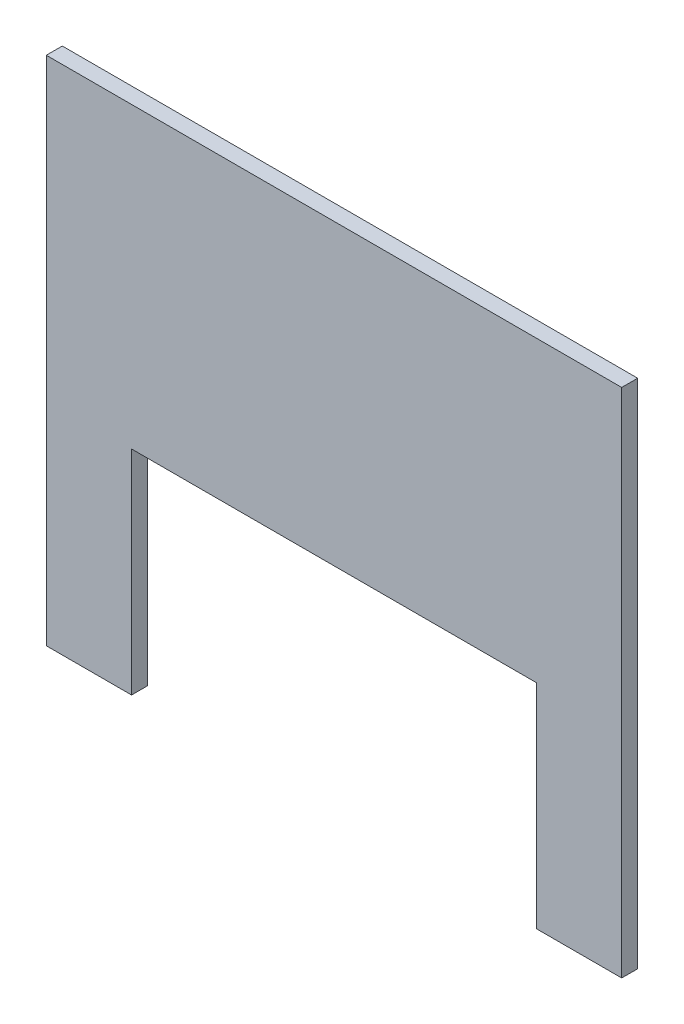
ISO-10303-21;
HEADER;
FILE_DESCRIPTION(('STEP AP214'),'2;1');
FILE_NAME('part.step','',(''),(''),'','','');
FILE_SCHEMA(('AUTOMOTIVE_DESIGN { 1 0 10303 214 1 1 1 1 }'));
ENDSEC;
DATA;
#1=APPLICATION_CONTEXT('core data for automotive mechanical design processes');
#2=APPLICATION_PROTOCOL_DEFINITION('international standard','automotive_design',2000,#1);
#3=PRODUCT_CONTEXT('',#1,'mechanical');
#4=PRODUCT('Part','Part','',(#3));
#5=PRODUCT_RELATED_PRODUCT_CATEGORY('part','',(#4));
#6=PRODUCT_DEFINITION_FORMATION('','',#4);
#7=PRODUCT_DEFINITION_CONTEXT('part definition',#1,'design');
#8=PRODUCT_DEFINITION('design','',#6,#7);
#9=PRODUCT_DEFINITION_SHAPE('','',#8);
#10=(LENGTH_UNIT() NAMED_UNIT(*) SI_UNIT(.MILLI.,.METRE.));
#11=(NAMED_UNIT(*) PLANE_ANGLE_UNIT() SI_UNIT($,.RADIAN.));
#12=(NAMED_UNIT(*) SI_UNIT($,.STERADIAN.) SOLID_ANGLE_UNIT());
#13=UNCERTAINTY_MEASURE_WITH_UNIT(LENGTH_MEASURE(1.E-05),#10,'distance_accuracy_value','');
#14=(GEOMETRIC_REPRESENTATION_CONTEXT(3) GLOBAL_UNCERTAINTY_ASSIGNED_CONTEXT((#13)) GLOBAL_UNIT_ASSIGNED_CONTEXT((#10,
#11,#12)) REPRESENTATION_CONTEXT('',''));
#15=CARTESIAN_POINT('',(0.,0.,0.));
#16=DIRECTION('',(0.,0.,1.));
#17=DIRECTION('',(1.,0.,0.));
#18=AXIS2_PLACEMENT_3D('',#15,#16,#17);
#19=CARTESIAN_POINT('',(0.,152.4,4.7625));
#20=DIRECTION('',(1.,0.,0.));
#21=DIRECTION('',(0.,1.,0.));
#22=AXIS2_PLACEMENT_3D('',#19,#20,#21);
#23=PLANE('',#22);
#24=DIRECTION('',(0.,-1.,0.));
#25=VECTOR('',#24,1.);
#26=CARTESIAN_POINT('',(0.,152.4,0.));
#27=LINE('',#26,#25);
#28=CARTESIAN_POINT('',(0.,152.4,0.));
#29=VERTEX_POINT('',#28);
#30=CARTESIAN_POINT('',(0.,0.,0.));
#31=VERTEX_POINT('',#30);
#32=EDGE_CURVE('E129',#29,#31,#27,.T.);
#33=ORIENTED_EDGE('',*,*,#32,.T.);
#34=DIRECTION('',(0.,0.,-1.));
#35=VECTOR('',#34,1.);
#36=CARTESIAN_POINT('',(0.,0.,4.7625));
#37=LINE('',#36,#35);
#38=CARTESIAN_POINT('',(0.,0.,4.7625));
#39=VERTEX_POINT('',#38);
#40=EDGE_CURVE('E11',#39,#31,#37,.T.);
#41=ORIENTED_EDGE('',*,*,#40,.F.);
#42=DIRECTION('',(0.,-1.,0.));
#43=VECTOR('',#42,1.);
#44=CARTESIAN_POINT('',(0.,152.4,4.7625));
#45=LINE('',#44,#43);
#46=CARTESIAN_POINT('',(0.,152.4,4.7625));
#47=VERTEX_POINT('',#46);
#48=EDGE_CURVE('E143',#47,#39,#45,.T.);
#49=ORIENTED_EDGE('',*,*,#48,.F.);
#50=DIRECTION('',(0.,0.,-1.));
#51=VECTOR('',#50,1.);
#52=CARTESIAN_POINT('',(0.,152.4,4.7625));
#53=LINE('',#52,#51);
#54=EDGE_CURVE('E125',#47,#29,#53,.T.);
#55=ORIENTED_EDGE('',*,*,#54,.T.);
#56=EDGE_LOOP('',(#33,#41,#49,#55));
#57=FACE_BOUND('',#56,.T.);
#58=ADVANCED_FACE('F33',(#57),#23,.F.);
#59=CARTESIAN_POINT('',(0.,0.,4.7625));
#60=DIRECTION('',(0.,1.,0.));
#61=DIRECTION('',(0.,0.,1.));
#62=AXIS2_PLACEMENT_3D('',#59,#60,#61);
#63=PLANE('',#62);
#64=DIRECTION('',(1.,0.,0.));
#65=VECTOR('',#64,1.);
#66=CARTESIAN_POINT('',(0.,0.,0.));
#67=LINE('',#66,#65);
#68=CARTESIAN_POINT('',(25.4,0.,0.));
#69=VERTEX_POINT('',#68);
#70=EDGE_CURVE('E132',#31,#69,#67,.T.);
#71=ORIENTED_EDGE('',*,*,#70,.T.);
#72=DIRECTION('',(0.,0.,-1.));
#73=VECTOR('',#72,1.);
#74=CARTESIAN_POINT('',(25.4,0.,4.7625));
#75=LINE('',#74,#73);
#76=CARTESIAN_POINT('',(25.4,0.,4.7625));
#77=VERTEX_POINT('',#76);
#78=EDGE_CURVE('E41',#77,#69,#75,.T.);
#79=ORIENTED_EDGE('',*,*,#78,.F.);
#80=DIRECTION('',(1.,0.,0.));
#81=VECTOR('',#80,1.);
#82=CARTESIAN_POINT('',(0.,0.,4.7625));
#83=LINE('',#82,#81);
#84=EDGE_CURVE('E92',#39,#77,#83,.T.);
#85=ORIENTED_EDGE('',*,*,#84,.F.);
#86=ORIENTED_EDGE('',*,*,#40,.T.);
#87=EDGE_LOOP('',(#71,#79,#85,#86));
#88=FACE_BOUND('',#87,.T.);
#89=ADVANCED_FACE('F178',(#88),#63,.F.);
#90=CARTESIAN_POINT('',(25.4,0.,4.7625));
#91=DIRECTION('',(-1.,0.,0.));
#92=DIRECTION('',(0.,0.,1.));
#93=AXIS2_PLACEMENT_3D('',#90,#91,#92);
#94=PLANE('',#93);
#95=DIRECTION('',(0.,1.,0.));
#96=VECTOR('',#95,1.);
#97=CARTESIAN_POINT('',(25.4,0.,0.));
#98=LINE('',#97,#96);
#99=CARTESIAN_POINT('',(25.4,63.5,0.));
#100=VERTEX_POINT('',#99);
#101=EDGE_CURVE('E134',#69,#100,#98,.T.);
#102=ORIENTED_EDGE('',*,*,#101,.T.);
#103=DIRECTION('',(0.,0.,-1.));
#104=VECTOR('',#103,1.);
#105=CARTESIAN_POINT('',(25.4,63.5,4.7625));
#106=LINE('',#105,#104);
#107=CARTESIAN_POINT('',(25.4,63.5,4.7625));
#108=VERTEX_POINT('',#107);
#109=EDGE_CURVE('E150',#108,#100,#106,.T.);
#110=ORIENTED_EDGE('',*,*,#109,.F.);
#111=DIRECTION('',(0.,1.,0.));
#112=VECTOR('',#111,1.);
#113=CARTESIAN_POINT('',(25.4,0.,4.7625));
#114=LINE('',#113,#112);
#115=EDGE_CURVE('E158',#77,#108,#114,.T.);
#116=ORIENTED_EDGE('',*,*,#115,.F.);
#117=ORIENTED_EDGE('',*,*,#78,.T.);
#118=EDGE_LOOP('',(#102,#110,#116,#117));
#119=FACE_BOUND('',#118,.T.);
#120=ADVANCED_FACE('F156',(#119),#94,.F.);
#121=CARTESIAN_POINT('',(25.4,63.5,4.7625));
#122=DIRECTION('',(0.,1.,0.));
#123=DIRECTION('',(0.,0.,1.));
#124=AXIS2_PLACEMENT_3D('',#121,#122,#123);
#125=PLANE('',#124);
#126=DIRECTION('',(1.,0.,0.));
#127=VECTOR('',#126,1.);
#128=CARTESIAN_POINT('',(25.4,63.5,0.));
#129=LINE('',#128,#127);
#130=CARTESIAN_POINT('',(146.05,63.5,0.));
#131=VERTEX_POINT('',#130);
#132=EDGE_CURVE('E136',#100,#131,#129,.T.);
#133=ORIENTED_EDGE('',*,*,#132,.T.);
#134=DIRECTION('',(0.,0.,-1.));
#135=VECTOR('',#134,1.);
#136=CARTESIAN_POINT('',(146.05,63.5,4.7625));
#137=LINE('',#136,#135);
#138=CARTESIAN_POINT('',(146.05,63.5,4.7625));
#139=VERTEX_POINT('',#138);
#140=EDGE_CURVE('E147',#139,#131,#137,.T.);
#141=ORIENTED_EDGE('',*,*,#140,.F.);
#142=DIRECTION('',(1.,0.,0.));
#143=VECTOR('',#142,1.);
#144=CARTESIAN_POINT('',(25.4,63.5,4.7625));
#145=LINE('',#144,#143);
#146=EDGE_CURVE('E170',#108,#139,#145,.T.);
#147=ORIENTED_EDGE('',*,*,#146,.F.);
#148=ORIENTED_EDGE('',*,*,#109,.T.);
#149=EDGE_LOOP('',(#133,#141,#147,#148));
#150=FACE_BOUND('',#149,.T.);
#151=ADVANCED_FACE('F166',(#150),#125,.F.);
#152=CARTESIAN_POINT('',(146.05,63.5,4.7625));
#153=DIRECTION('',(1.,0.,0.));
#154=DIRECTION('',(0.,0.,-1.));
#155=AXIS2_PLACEMENT_3D('',#152,#153,#154);
#156=PLANE('',#155);
#157=DIRECTION('',(0.,-1.,0.));
#158=VECTOR('',#157,1.);
#159=CARTESIAN_POINT('',(146.05,63.5,0.));
#160=LINE('',#159,#158);
#161=CARTESIAN_POINT('',(146.05,0.,0.));
#162=VERTEX_POINT('',#161);
#163=EDGE_CURVE('E138',#131,#162,#160,.T.);
#164=ORIENTED_EDGE('',*,*,#163,.T.);
#165=DIRECTION('',(0.,0.,-1.));
#166=VECTOR('',#165,1.);
#167=CARTESIAN_POINT('',(146.05,0.,4.7625));
#168=LINE('',#167,#166);
#169=CARTESIAN_POINT('',(146.05,0.,4.7625));
#170=VERTEX_POINT('',#169);
#171=EDGE_CURVE('E120',#170,#162,#168,.T.);
#172=ORIENTED_EDGE('',*,*,#171,.F.);
#173=DIRECTION('',(0.,-1.,0.));
#174=VECTOR('',#173,1.);
#175=CARTESIAN_POINT('',(146.05,63.5,4.7625));
#176=LINE('',#175,#174);
#177=EDGE_CURVE('E111',#139,#170,#176,.T.);
#178=ORIENTED_EDGE('',*,*,#177,.F.);
#179=ORIENTED_EDGE('',*,*,#140,.T.);
#180=EDGE_LOOP('',(#164,#172,#178,#179));
#181=FACE_BOUND('',#180,.T.);
#182=ADVANCED_FACE('F169',(#181),#156,.F.);
#183=CARTESIAN_POINT('',(146.05,0.,4.7625));
#184=DIRECTION('',(0.,1.,0.));
#185=DIRECTION('',(0.,0.,1.));
#186=AXIS2_PLACEMENT_3D('',#183,#184,#185);
#187=PLANE('',#186);
#188=DIRECTION('',(1.,0.,0.));
#189=VECTOR('',#188,1.);
#190=CARTESIAN_POINT('',(146.05,0.,0.));
#191=LINE('',#190,#189);
#192=CARTESIAN_POINT('',(171.45,0.,0.));
#193=VERTEX_POINT('',#192);
#194=EDGE_CURVE('E119',#162,#193,#191,.T.);
#195=ORIENTED_EDGE('',*,*,#194,.T.);
#196=DIRECTION('',(0.,0.,-1.));
#197=VECTOR('',#196,1.);
#198=CARTESIAN_POINT('',(171.45,0.,4.7625));
#199=LINE('',#198,#197);
#200=CARTESIAN_POINT('',(171.45,0.,4.7625));
#201=VERTEX_POINT('',#200);
#202=EDGE_CURVE('E116',#201,#193,#199,.T.);
#203=ORIENTED_EDGE('',*,*,#202,.F.);
#204=DIRECTION('',(1.,0.,0.));
#205=VECTOR('',#204,1.);
#206=CARTESIAN_POINT('',(146.05,0.,4.7625));
#207=LINE('',#206,#205);
#208=EDGE_CURVE('E105',#170,#201,#207,.T.);
#209=ORIENTED_EDGE('',*,*,#208,.F.);
#210=ORIENTED_EDGE('',*,*,#171,.T.);
#211=EDGE_LOOP('',(#195,#203,#209,#210));
#212=FACE_BOUND('',#211,.T.);
#213=ADVANCED_FACE('F117',(#212),#187,.F.);
#214=CARTESIAN_POINT('',(171.45,0.,4.7625));
#215=DIRECTION('',(-1.,0.,0.));
#216=DIRECTION('',(0.,0.,1.));
#217=AXIS2_PLACEMENT_3D('',#214,#215,#216);
#218=PLANE('',#217);
#219=DIRECTION('',(0.,1.,0.));
#220=VECTOR('',#219,1.);
#221=CARTESIAN_POINT('',(171.45,0.,0.));
#222=LINE('',#221,#220);
#223=CARTESIAN_POINT('',(171.45,152.4,0.));
#224=VERTEX_POINT('',#223);
#225=EDGE_CURVE('E78',#193,#224,#222,.T.);
#226=ORIENTED_EDGE('',*,*,#225,.T.);
#227=DIRECTION('',(0.,0.,-1.));
#228=VECTOR('',#227,1.);
#229=CARTESIAN_POINT('',(171.45,152.4,4.7625));
#230=LINE('',#229,#228);
#231=CARTESIAN_POINT('',(171.45,152.4,4.7625));
#232=VERTEX_POINT('',#231);
#233=EDGE_CURVE('E121',#232,#224,#230,.T.);
#234=ORIENTED_EDGE('',*,*,#233,.F.);
#235=DIRECTION('',(0.,1.,0.));
#236=VECTOR('',#235,1.);
#237=CARTESIAN_POINT('',(171.45,0.,4.7625));
#238=LINE('',#237,#236);
#239=EDGE_CURVE('E109',#201,#232,#238,.T.);
#240=ORIENTED_EDGE('',*,*,#239,.F.);
#241=ORIENTED_EDGE('',*,*,#202,.T.);
#242=EDGE_LOOP('',(#226,#234,#240,#241));
#243=FACE_BOUND('',#242,.T.);
#244=ADVANCED_FACE('F123',(#243),#218,.F.);
#245=CARTESIAN_POINT('',(171.45,152.4,4.7625));
#246=DIRECTION('',(0.,-1.,0.));
#247=DIRECTION('',(1.,0.,0.));
#248=AXIS2_PLACEMENT_3D('',#245,#246,#247);
#249=PLANE('',#248);
#250=DIRECTION('',(-1.,0.,0.));
#251=VECTOR('',#250,1.);
#252=CARTESIAN_POINT('',(171.45,152.4,0.));
#253=LINE('',#252,#251);
#254=EDGE_CURVE('E84',#224,#29,#253,.T.);
#255=ORIENTED_EDGE('',*,*,#254,.T.);
#256=ORIENTED_EDGE('',*,*,#54,.F.);
#257=DIRECTION('',(-1.,0.,0.));
#258=VECTOR('',#257,1.);
#259=CARTESIAN_POINT('',(171.45,152.4,4.7625));
#260=LINE('',#259,#258);
#261=EDGE_CURVE('E49',#232,#47,#260,.T.);
#262=ORIENTED_EDGE('',*,*,#261,.F.);
#263=ORIENTED_EDGE('',*,*,#233,.T.);
#264=EDGE_LOOP('',(#255,#256,#262,#263));
#265=FACE_BOUND('',#264,.T.);
#266=ADVANCED_FACE('F194',(#265),#249,.F.);
#267=CARTESIAN_POINT('',(0.,0.,4.7625));
#268=DIRECTION('',(0.,0.,1.));
#269=DIRECTION('',(1.,0.,0.));
#270=AXIS2_PLACEMENT_3D('',#267,#268,#269);
#271=PLANE('',#270);
#272=ORIENTED_EDGE('',*,*,#48,.T.);
#273=ORIENTED_EDGE('',*,*,#84,.T.);
#274=ORIENTED_EDGE('',*,*,#115,.T.);
#275=ORIENTED_EDGE('',*,*,#146,.T.);
#276=ORIENTED_EDGE('',*,*,#177,.T.);
#277=ORIENTED_EDGE('',*,*,#208,.T.);
#278=ORIENTED_EDGE('',*,*,#239,.T.);
#279=ORIENTED_EDGE('',*,*,#261,.T.);
#280=EDGE_LOOP('',(#272,#273,#274,#275,#276,#277,#278,#279));
#281=FACE_BOUND('',#280,.T.);
#282=ADVANCED_FACE('F107',(#281),#271,.T.);
#283=CARTESIAN_POINT('',(0.,0.,0.));
#284=DIRECTION('',(0.,0.,1.));
#285=DIRECTION('',(1.,0.,0.));
#286=AXIS2_PLACEMENT_3D('',#283,#284,#285);
#287=PLANE('',#286);
#288=ORIENTED_EDGE('',*,*,#32,.F.);
#289=ORIENTED_EDGE('',*,*,#254,.F.);
#290=ORIENTED_EDGE('',*,*,#225,.F.);
#291=ORIENTED_EDGE('',*,*,#194,.F.);
#292=ORIENTED_EDGE('',*,*,#163,.F.);
#293=ORIENTED_EDGE('',*,*,#132,.F.);
#294=ORIENTED_EDGE('',*,*,#101,.F.);
#295=ORIENTED_EDGE('',*,*,#70,.F.);
#296=EDGE_LOOP('',(#288,#289,#290,#291,#292,#293,#294,#295));
#297=FACE_BOUND('',#296,.T.);
#298=ADVANCED_FACE('F162',(#297),#287,.F.);
#299=CLOSED_SHELL('',(#58,#89,#120,#151,#182,#213,#244,#266,#282,#298));
#300=MANIFOLD_SOLID_BREP('B2',#299);
#301=ADVANCED_BREP_SHAPE_REPRESENTATION('',(#18,#300),#14);
#302=SHAPE_DEFINITION_REPRESENTATION(#9,#301);
ENDSEC;
END-ISO-10303-21;
